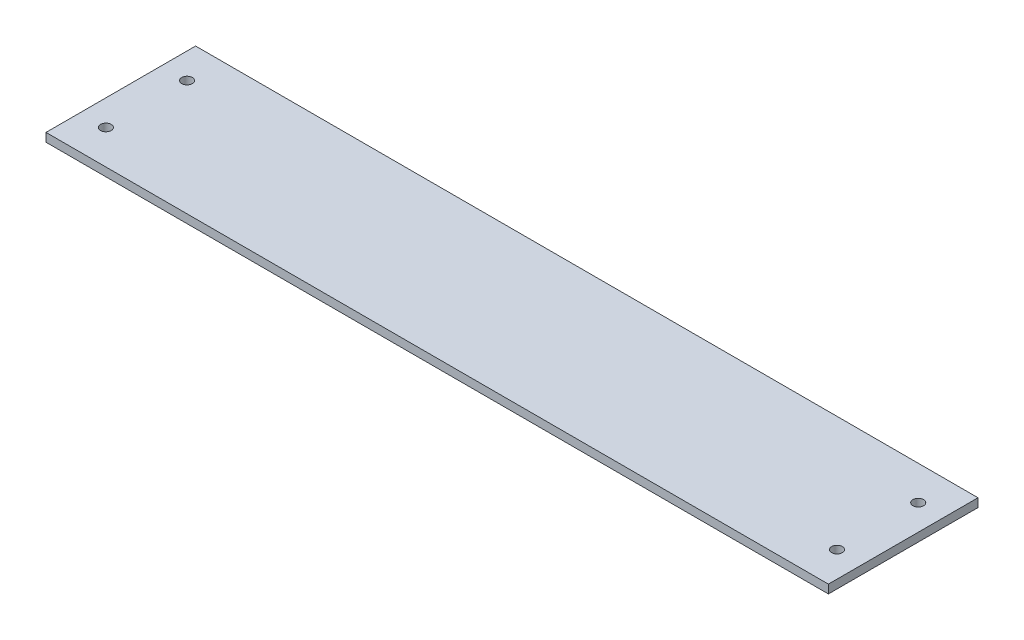
ISO-10303-21;
HEADER;
FILE_DESCRIPTION(('STEP AP214'),'2;1');
FILE_NAME('part.step','',(''),(''),'','','');
FILE_SCHEMA(('AUTOMOTIVE_DESIGN { 1 0 10303 214 1 1 1 1 }'));
ENDSEC;
DATA;
#1=APPLICATION_CONTEXT('core data for automotive mechanical design processes');
#2=APPLICATION_PROTOCOL_DEFINITION('international standard','automotive_design',2000,#1);
#3=PRODUCT_CONTEXT('',#1,'mechanical');
#4=PRODUCT('Part','Part','',(#3));
#5=PRODUCT_RELATED_PRODUCT_CATEGORY('part','',(#4));
#6=PRODUCT_DEFINITION_FORMATION('','',#4);
#7=PRODUCT_DEFINITION_CONTEXT('part definition',#1,'design');
#8=PRODUCT_DEFINITION('design','',#6,#7);
#9=PRODUCT_DEFINITION_SHAPE('','',#8);
#10=(LENGTH_UNIT() NAMED_UNIT(*) SI_UNIT(.MILLI.,.METRE.));
#11=(NAMED_UNIT(*) PLANE_ANGLE_UNIT() SI_UNIT($,.RADIAN.));
#12=(NAMED_UNIT(*) SI_UNIT($,.STERADIAN.) SOLID_ANGLE_UNIT());
#13=UNCERTAINTY_MEASURE_WITH_UNIT(LENGTH_MEASURE(1.E-05),#10,'distance_accuracy_value','');
#14=(GEOMETRIC_REPRESENTATION_CONTEXT(3) GLOBAL_UNCERTAINTY_ASSIGNED_CONTEXT((#13)) GLOBAL_UNIT_ASSIGNED_CONTEXT((#10,
#11,#12)) REPRESENTATION_CONTEXT('',''));
#15=CARTESIAN_POINT('',(0.,0.,0.));
#16=DIRECTION('',(0.,0.,1.));
#17=DIRECTION('',(1.,0.,0.));
#18=AXIS2_PLACEMENT_3D('',#15,#16,#17);
#19=CARTESIAN_POINT('',(91.52,-2.,-17.5));
#20=DIRECTION('',(1.,0.,0.));
#21=DIRECTION('',(0.,0.,-1.));
#22=AXIS2_PLACEMENT_3D('',#19,#20,#21);
#23=PLANE('',#22);
#24=DIRECTION('',(0.,0.,-1.));
#25=VECTOR('',#24,1.);
#26=CARTESIAN_POINT('',(91.52,0.,-17.5));
#27=LINE('',#26,#25);
#28=CARTESIAN_POINT('',(91.52,0.,17.5));
#29=VERTEX_POINT('',#28);
#30=CARTESIAN_POINT('',(91.52,0.,-17.5));
#31=VERTEX_POINT('',#30);
#32=EDGE_CURVE('E105',#29,#31,#27,.T.);
#33=ORIENTED_EDGE('',*,*,#32,.F.);
#34=DIRECTION('',(0.,1.,0.));
#35=VECTOR('',#34,1.);
#36=CARTESIAN_POINT('',(91.52,-2.,17.5));
#37=LINE('',#36,#35);
#38=CARTESIAN_POINT('',(91.52,-2.,17.5));
#39=VERTEX_POINT('',#38);
#40=EDGE_CURVE('E11',#39,#29,#37,.T.);
#41=ORIENTED_EDGE('',*,*,#40,.F.);
#42=DIRECTION('',(0.,0.,-1.));
#43=VECTOR('',#42,1.);
#44=CARTESIAN_POINT('',(91.52,-2.,-17.5));
#45=LINE('',#44,#43);
#46=CARTESIAN_POINT('',(91.52,-2.,-17.5));
#47=VERTEX_POINT('',#46);
#48=EDGE_CURVE('E98',#39,#47,#45,.T.);
#49=ORIENTED_EDGE('',*,*,#48,.T.);
#50=DIRECTION('',(0.,1.,0.));
#51=VECTOR('',#50,1.);
#52=CARTESIAN_POINT('',(91.52,-2.,-17.5));
#53=LINE('',#52,#51);
#54=EDGE_CURVE('E81',#47,#31,#53,.T.);
#55=ORIENTED_EDGE('',*,*,#54,.T.);
#56=EDGE_LOOP('',(#33,#41,#49,#55));
#57=FACE_BOUND('',#56,.T.);
#58=ADVANCED_FACE('F38',(#57),#23,.T.);
#59=CARTESIAN_POINT('',(-91.52,-2.,17.5));
#60=DIRECTION('',(0.,0.,1.));
#61=DIRECTION('',(1.,0.,0.));
#62=AXIS2_PLACEMENT_3D('',#59,#60,#61);
#63=PLANE('',#62);
#64=DIRECTION('',(1.,0.,0.));
#65=VECTOR('',#64,1.);
#66=CARTESIAN_POINT('',(-91.52,0.,17.5));
#67=LINE('',#66,#65);
#68=CARTESIAN_POINT('',(-91.52,0.,17.5));
#69=VERTEX_POINT('',#68);
#70=EDGE_CURVE('E100',#69,#29,#67,.T.);
#71=ORIENTED_EDGE('',*,*,#70,.F.);
#72=DIRECTION('',(0.,1.,0.));
#73=VECTOR('',#72,1.);
#74=CARTESIAN_POINT('',(-91.52,-2.,17.5));
#75=LINE('',#74,#73);
#76=CARTESIAN_POINT('',(-91.52,-2.,17.5));
#77=VERTEX_POINT('',#76);
#78=EDGE_CURVE('E47',#77,#69,#75,.T.);
#79=ORIENTED_EDGE('',*,*,#78,.F.);
#80=DIRECTION('',(1.,0.,0.));
#81=VECTOR('',#80,1.);
#82=CARTESIAN_POINT('',(-91.52,-2.,17.5));
#83=LINE('',#82,#81);
#84=EDGE_CURVE('E95',#77,#39,#83,.T.);
#85=ORIENTED_EDGE('',*,*,#84,.T.);
#86=ORIENTED_EDGE('',*,*,#40,.T.);
#87=EDGE_LOOP('',(#71,#79,#85,#86));
#88=FACE_BOUND('',#87,.T.);
#89=ADVANCED_FACE('F116',(#88),#63,.T.);
#90=CARTESIAN_POINT('',(-91.52,-2.,-17.5));
#91=DIRECTION('',(-1.,0.,0.));
#92=DIRECTION('',(0.,0.,1.));
#93=AXIS2_PLACEMENT_3D('',#90,#91,#92);
#94=PLANE('',#93);
#95=DIRECTION('',(0.,0.,1.));
#96=VECTOR('',#95,1.);
#97=CARTESIAN_POINT('',(-91.52,0.,-17.5));
#98=LINE('',#97,#96);
#99=CARTESIAN_POINT('',(-91.52,0.,-17.5));
#100=VERTEX_POINT('',#99);
#101=EDGE_CURVE('E89',#100,#69,#98,.T.);
#102=ORIENTED_EDGE('',*,*,#101,.F.);
#103=DIRECTION('',(0.,1.,0.));
#104=VECTOR('',#103,1.);
#105=CARTESIAN_POINT('',(-91.52,-2.,-17.5));
#106=LINE('',#105,#104);
#107=CARTESIAN_POINT('',(-91.52,-2.,-17.5));
#108=VERTEX_POINT('',#107);
#109=EDGE_CURVE('E84',#108,#100,#106,.T.);
#110=ORIENTED_EDGE('',*,*,#109,.F.);
#111=DIRECTION('',(0.,0.,1.));
#112=VECTOR('',#111,1.);
#113=CARTESIAN_POINT('',(-91.52,-2.,-17.5));
#114=LINE('',#113,#112);
#115=EDGE_CURVE('E87',#108,#77,#114,.T.);
#116=ORIENTED_EDGE('',*,*,#115,.T.);
#117=ORIENTED_EDGE('',*,*,#78,.T.);
#118=EDGE_LOOP('',(#102,#110,#116,#117));
#119=FACE_BOUND('',#118,.T.);
#120=ADVANCED_FACE('F86',(#119),#94,.T.);
#121=CARTESIAN_POINT('',(-91.52,-2.,-17.5));
#122=DIRECTION('',(0.,0.,-1.));
#123=DIRECTION('',(-1.,0.,0.));
#124=AXIS2_PLACEMENT_3D('',#121,#122,#123);
#125=PLANE('',#124);
#126=DIRECTION('',(-1.,0.,0.));
#127=VECTOR('',#126,1.);
#128=CARTESIAN_POINT('',(-91.52,0.,-17.5));
#129=LINE('',#128,#127);
#130=EDGE_CURVE('E108',#31,#100,#129,.T.);
#131=ORIENTED_EDGE('',*,*,#130,.F.);
#132=ORIENTED_EDGE('',*,*,#54,.F.);
#133=DIRECTION('',(-1.,0.,0.));
#134=VECTOR('',#133,1.);
#135=CARTESIAN_POINT('',(-91.52,-2.,-17.5));
#136=LINE('',#135,#134);
#137=EDGE_CURVE('E94',#47,#108,#136,.T.);
#138=ORIENTED_EDGE('',*,*,#137,.T.);
#139=ORIENTED_EDGE('',*,*,#109,.T.);
#140=EDGE_LOOP('',(#131,#132,#138,#139));
#141=FACE_BOUND('',#140,.T.);
#142=ADVANCED_FACE('F97',(#141),#125,.T.);
#143=CARTESIAN_POINT('',(0.,-2.,0.));
#144=DIRECTION('',(0.,1.,0.));
#145=DIRECTION('',(0.,0.,1.));
#146=AXIS2_PLACEMENT_3D('',#143,#144,#145);
#147=PLANE('',#146);
#148=CARTESIAN_POINT('',(85.53850289722,-2.00000000000417,-9.50000000000001));
#149=DIRECTION('',(0.,1.,0.));
#150=DIRECTION('',(0.,0.,1.));
#151=AXIS2_PLACEMENT_3D('',#148,#149,#150);
#152=CIRCLE('',#151,1.25);
#153=CARTESIAN_POINT('',(85.53850289722,-2.00000000000417,-8.25000000000001));
#154=VERTEX_POINT('',#153);
#155=EDGE_CURVE('E160',#154,#154,#152,.T.);
#156=ORIENTED_EDGE('',*,*,#155,.T.);
#157=EDGE_LOOP('',(#156));
#158=FACE_BOUND('',#157,.T.);
#159=CARTESIAN_POINT('',(85.53850289722,-2.00000000000417,9.49999999999998));
#160=DIRECTION('',(0.,1.,0.));
#161=DIRECTION('',(0.,0.,1.));
#162=AXIS2_PLACEMENT_3D('',#159,#160,#161);
#163=CIRCLE('',#162,1.25);
#164=CARTESIAN_POINT('',(85.53850289722,-2.00000000000417,10.75));
#165=VERTEX_POINT('',#164);
#166=EDGE_CURVE('E162',#165,#165,#163,.T.);
#167=ORIENTED_EDGE('',*,*,#166,.T.);
#168=EDGE_LOOP('',(#167));
#169=FACE_BOUND('',#168,.T.);
#170=CARTESIAN_POINT('',(-85.52,-2.00000000000239,-9.49999999999997));
#171=DIRECTION('',(0.,1.,0.));
#172=DIRECTION('',(0.,0.,1.));
#173=AXIS2_PLACEMENT_3D('',#170,#171,#172);
#174=CIRCLE('',#173,1.25);
#175=CARTESIAN_POINT('',(-85.52,-2.00000000000239,-8.24999999999997));
#176=VERTEX_POINT('',#175);
#177=EDGE_CURVE('E169',#176,#176,#174,.T.);
#178=ORIENTED_EDGE('',*,*,#177,.T.);
#179=EDGE_LOOP('',(#178));
#180=FACE_BOUND('',#179,.T.);
#181=CARTESIAN_POINT('',(-85.52,-2.00000000000239,9.50000000000003));
#182=DIRECTION('',(0.,1.,0.));
#183=DIRECTION('',(0.,0.,1.));
#184=AXIS2_PLACEMENT_3D('',#181,#182,#183);
#185=CIRCLE('',#184,1.25);
#186=CARTESIAN_POINT('',(-85.52,-2.00000000000239,10.75));
#187=VERTEX_POINT('',#186);
#188=EDGE_CURVE('E175',#187,#187,#185,.T.);
#189=ORIENTED_EDGE('',*,*,#188,.T.);
#190=EDGE_LOOP('',(#189));
#191=FACE_BOUND('',#190,.T.);
#192=ORIENTED_EDGE('',*,*,#48,.F.);
#193=ORIENTED_EDGE('',*,*,#84,.F.);
#194=ORIENTED_EDGE('',*,*,#115,.F.);
#195=ORIENTED_EDGE('',*,*,#137,.F.);
#196=EDGE_LOOP('',(#192,#193,#194,#195));
#197=FACE_BOUND('',#196,.T.);
#198=ADVANCED_FACE('F93',(#158,#169,#180,#191,#197),#147,.F.);
#199=CARTESIAN_POINT('',(0.,0.,0.));
#200=DIRECTION('',(0.,1.,0.));
#201=DIRECTION('',(0.,0.,1.));
#202=AXIS2_PLACEMENT_3D('',#199,#200,#201);
#203=PLANE('',#202);
#204=CARTESIAN_POINT('',(85.53850289722,0.,-9.50000000000001));
#205=DIRECTION('',(0.,1.,0.));
#206=DIRECTION('',(0.,0.,1.));
#207=AXIS2_PLACEMENT_3D('',#204,#205,#206);
#208=CIRCLE('',#207,1.25);
#209=CARTESIAN_POINT('',(85.53850289722,0.,-8.25000000000001));
#210=VERTEX_POINT('',#209);
#211=EDGE_CURVE('E41',#210,#210,#208,.T.);
#212=ORIENTED_EDGE('',*,*,#211,.F.);
#213=EDGE_LOOP('',(#212));
#214=FACE_BOUND('',#213,.T.);
#215=CARTESIAN_POINT('',(85.53850289722,0.,9.49999999999998));
#216=DIRECTION('',(0.,1.,0.));
#217=DIRECTION('',(0.,0.,1.));
#218=AXIS2_PLACEMENT_3D('',#215,#216,#217);
#219=CIRCLE('',#218,1.25);
#220=CARTESIAN_POINT('',(85.53850289722,0.,10.75));
#221=VERTEX_POINT('',#220);
#222=EDGE_CURVE('E166',#221,#221,#219,.T.);
#223=ORIENTED_EDGE('',*,*,#222,.F.);
#224=EDGE_LOOP('',(#223));
#225=FACE_BOUND('',#224,.T.);
#226=CARTESIAN_POINT('',(-85.52,0.,-9.49999999999997));
#227=DIRECTION('',(0.,1.,0.));
#228=DIRECTION('',(0.,0.,1.));
#229=AXIS2_PLACEMENT_3D('',#226,#227,#228);
#230=CIRCLE('',#229,1.25);
#231=CARTESIAN_POINT('',(-85.52,0.,-8.24999999999997));
#232=VERTEX_POINT('',#231);
#233=EDGE_CURVE('E172',#232,#232,#230,.T.);
#234=ORIENTED_EDGE('',*,*,#233,.F.);
#235=EDGE_LOOP('',(#234));
#236=FACE_BOUND('',#235,.T.);
#237=CARTESIAN_POINT('',(-85.52,0.,9.50000000000003));
#238=DIRECTION('',(0.,1.,0.));
#239=DIRECTION('',(0.,0.,1.));
#240=AXIS2_PLACEMENT_3D('',#237,#238,#239);
#241=CIRCLE('',#240,1.25);
#242=CARTESIAN_POINT('',(-85.52,0.,10.75));
#243=VERTEX_POINT('',#242);
#244=EDGE_CURVE('E109',#243,#243,#241,.T.);
#245=ORIENTED_EDGE('',*,*,#244,.F.);
#246=EDGE_LOOP('',(#245));
#247=FACE_BOUND('',#246,.T.);
#248=ORIENTED_EDGE('',*,*,#32,.T.);
#249=ORIENTED_EDGE('',*,*,#130,.T.);
#250=ORIENTED_EDGE('',*,*,#101,.T.);
#251=ORIENTED_EDGE('',*,*,#70,.T.);
#252=EDGE_LOOP('',(#248,#249,#250,#251));
#253=FACE_BOUND('',#252,.T.);
#254=ADVANCED_FACE('F115',(#214,#225,#236,#247,#253),#203,.T.);
#255=CARTESIAN_POINT('',(-85.52,1.99999999999973,9.50000000000003));
#256=DIRECTION('',(0.,1.,0.));
#257=DIRECTION('',(0.,0.,1.));
#258=AXIS2_PLACEMENT_3D('',#255,#256,#257);
#259=CYLINDRICAL_SURFACE('',#258,1.25);
#260=ORIENTED_EDGE('',*,*,#244,.T.);
#261=EDGE_LOOP('',(#260));
#262=FACE_BOUND('',#261,.T.);
#263=ORIENTED_EDGE('',*,*,#188,.F.);
#264=EDGE_LOOP('',(#263));
#265=FACE_BOUND('',#264,.T.);
#266=ADVANCED_FACE('F135',(#262,#265),#259,.F.);
#267=CARTESIAN_POINT('',(-85.52,1.99999999999972,-9.49999999999997));
#268=DIRECTION('',(0.,1.,0.));
#269=DIRECTION('',(0.,0.,1.));
#270=AXIS2_PLACEMENT_3D('',#267,#268,#269);
#271=CYLINDRICAL_SURFACE('',#270,1.25);
#272=ORIENTED_EDGE('',*,*,#233,.T.);
#273=EDGE_LOOP('',(#272));
#274=FACE_BOUND('',#273,.T.);
#275=ORIENTED_EDGE('',*,*,#177,.F.);
#276=EDGE_LOOP('',(#275));
#277=FACE_BOUND('',#276,.T.);
#278=ADVANCED_FACE('F142',(#274,#277),#271,.F.);
#279=CARTESIAN_POINT('',(85.53850289722,1.99999999999988,9.49999999999998));
#280=DIRECTION('',(0.,1.,0.));
#281=DIRECTION('',(0.,0.,1.));
#282=AXIS2_PLACEMENT_3D('',#279,#280,#281);
#283=CYLINDRICAL_SURFACE('',#282,1.25);
#284=ORIENTED_EDGE('',*,*,#222,.T.);
#285=EDGE_LOOP('',(#284));
#286=FACE_BOUND('',#285,.T.);
#287=ORIENTED_EDGE('',*,*,#166,.F.);
#288=EDGE_LOOP('',(#287));
#289=FACE_BOUND('',#288,.T.);
#290=ADVANCED_FACE('F146',(#286,#289),#283,.F.);
#291=CARTESIAN_POINT('',(85.53850289722,1.99999999999988,-9.50000000000001));
#292=DIRECTION('',(0.,1.,0.));
#293=DIRECTION('',(0.,0.,1.));
#294=AXIS2_PLACEMENT_3D('',#291,#292,#293);
#295=CYLINDRICAL_SURFACE('',#294,1.25);
#296=ORIENTED_EDGE('',*,*,#211,.T.);
#297=EDGE_LOOP('',(#296));
#298=FACE_BOUND('',#297,.T.);
#299=ORIENTED_EDGE('',*,*,#155,.F.);
#300=EDGE_LOOP('',(#299));
#301=FACE_BOUND('',#300,.T.);
#302=ADVANCED_FACE('F150',(#298,#301),#295,.F.);
#303=CLOSED_SHELL('',(#58,#89,#120,#142,#198,#254,#266,#278,#290,#302));
#304=MANIFOLD_SOLID_BREP('B2',#303);
#305=ADVANCED_BREP_SHAPE_REPRESENTATION('',(#18,#304),#14);
#306=SHAPE_DEFINITION_REPRESENTATION(#9,#305);
ENDSEC;
END-ISO-10303-21;
